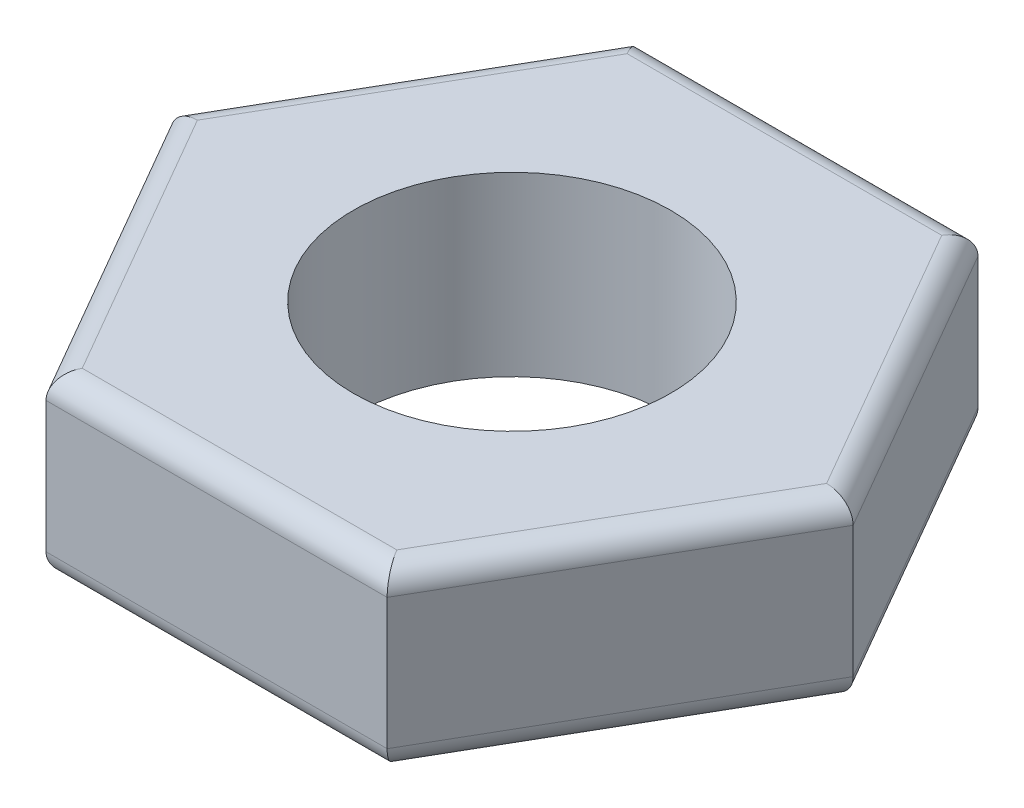
ISO-10303-21;
HEADER;
FILE_DESCRIPTION(('STEP AP214'),'2;1');
FILE_NAME('part.step','',(''),(''),'','','');
FILE_SCHEMA(('AUTOMOTIVE_DESIGN { 1 0 10303 214 1 1 1 1 }'));
ENDSEC;
DATA;
#1=APPLICATION_CONTEXT('core data for automotive mechanical design processes');
#2=APPLICATION_PROTOCOL_DEFINITION('international standard','automotive_design',2000,#1);
#3=PRODUCT_CONTEXT('',#1,'mechanical');
#4=PRODUCT('Part','Part','',(#3));
#5=PRODUCT_RELATED_PRODUCT_CATEGORY('part','',(#4));
#6=PRODUCT_DEFINITION_FORMATION('','',#4);
#7=PRODUCT_DEFINITION_CONTEXT('part definition',#1,'design');
#8=PRODUCT_DEFINITION('design','',#6,#7);
#9=PRODUCT_DEFINITION_SHAPE('','',#8);
#10=(LENGTH_UNIT() NAMED_UNIT(*) SI_UNIT(.MILLI.,.METRE.));
#11=(NAMED_UNIT(*) PLANE_ANGLE_UNIT() SI_UNIT($,.RADIAN.));
#12=(NAMED_UNIT(*) SI_UNIT($,.STERADIAN.) SOLID_ANGLE_UNIT());
#13=UNCERTAINTY_MEASURE_WITH_UNIT(LENGTH_MEASURE(1.E-05),#10,'distance_accuracy_value','');
#14=(GEOMETRIC_REPRESENTATION_CONTEXT(3) GLOBAL_UNCERTAINTY_ASSIGNED_CONTEXT((#13)) GLOBAL_UNIT_ASSIGNED_CONTEXT((#10,
#11,#12)) REPRESENTATION_CONTEXT('',''));
#15=CARTESIAN_POINT('',(0.,0.,0.));
#16=DIRECTION('',(0.,0.,1.));
#17=DIRECTION('',(1.,0.,0.));
#18=AXIS2_PLACEMENT_3D('',#15,#16,#17);
#19=CARTESIAN_POINT('',(0.,3.85,0.));
#20=DIRECTION('',(0.,1.,0.));
#21=DIRECTION('',(0.,0.,1.));
#22=AXIS2_PLACEMENT_3D('',#19,#20,#21);
#23=PLANE('',#22);
#24=DIRECTION('',(-0.500000000000001,0.,-0.866025403784438));
#25=VECTOR('',#24,1.);
#26=CARTESIAN_POINT('',(3.27646277765111,3.85,-6.17500000000001));
#27=LINE('',#26,#25);
#28=CARTESIAN_POINT('',(6.84160068989707,3.85,0.));
#29=VERTEX_POINT('',#28);
#30=CARTESIAN_POINT('',(3.42080034494852,3.85,-5.92500000000001));
#31=VERTEX_POINT('',#30);
#32=EDGE_CURVE('E64',#29,#31,#27,.T.);
#33=ORIENTED_EDGE('',*,*,#32,.T.);
#34=DIRECTION('',(-1.,0.,0.));
#35=VECTOR('',#34,1.);
#36=CARTESIAN_POINT('',(-3.70947547954338,3.85,-5.92499999999999));
#37=LINE('',#36,#35);
#38=CARTESIAN_POINT('',(-3.42080034494856,3.85,-5.92499999999999));
#39=VERTEX_POINT('',#38);
#40=EDGE_CURVE('E11',#31,#39,#37,.T.);
#41=ORIENTED_EDGE('',*,*,#40,.T.);
#42=DIRECTION('',(-0.499999999999995,0.,0.866025403784442));
#43=VECTOR('',#42,1.);
#44=CARTESIAN_POINT('',(-6.98593825719447,3.85,0.25000000000005));
#45=LINE('',#44,#43);
#46=CARTESIAN_POINT('',(-6.84160068989707,3.85,0.));
#47=VERTEX_POINT('',#46);
#48=EDGE_CURVE('E49',#39,#47,#45,.T.);
#49=ORIENTED_EDGE('',*,*,#48,.T.);
#50=DIRECTION('',(0.500000000000007,0.,0.866025403784435));
#51=VECTOR('',#50,1.);
#52=CARTESIAN_POINT('',(-3.27646277765107,3.85,6.17500000000004));
#53=LINE('',#52,#51);
#54=CARTESIAN_POINT('',(-3.42080034494848,3.85,5.92500000000004));
#55=VERTEX_POINT('',#54);
#56=EDGE_CURVE('E231',#47,#55,#53,.T.);
#57=ORIENTED_EDGE('',*,*,#56,.T.);
#58=DIRECTION('',(1.,0.,0.));
#59=VECTOR('',#58,1.);
#60=CARTESIAN_POINT('',(3.70947547954342,3.85,5.92499999999996));
#61=LINE('',#60,#59);
#62=CARTESIAN_POINT('',(3.42080034494861,3.85,5.92499999999997));
#63=VERTEX_POINT('',#62);
#64=EDGE_CURVE('E163',#55,#63,#61,.T.);
#65=ORIENTED_EDGE('',*,*,#64,.T.);
#66=DIRECTION('',(0.499999999999995,0.,-0.866025403784442));
#67=VECTOR('',#66,1.);
#68=CARTESIAN_POINT('',(6.98593825719448,3.85,-0.249999999999998));
#69=LINE('',#68,#67);
#70=EDGE_CURVE('E234',#63,#29,#69,.T.);
#71=ORIENTED_EDGE('',*,*,#70,.T.);
#72=EDGE_LOOP('',(#33,#41,#49,#57,#65,#71));
#73=FACE_BOUND('',#72,.T.);
#74=CARTESIAN_POINT('',(0.,3.85,0.));
#75=DIRECTION('',(0.,1.,0.));
#76=DIRECTION('',(0.,0.,1.));
#77=AXIS2_PLACEMENT_3D('',#74,#75,#76);
#78=CIRCLE('',#77,3.45);
#79=CARTESIAN_POINT('',(0.,3.85,-3.45));
#80=VERTEX_POINT('',#79);
#81=EDGE_CURVE('E325',#80,#80,#78,.T.);
#82=ORIENTED_EDGE('',*,*,#81,.F.);
#83=EDGE_LOOP('',(#82));
#84=FACE_BOUND('',#83,.T.);
#85=ADVANCED_FACE('F39',(#73,#84),#23,.T.);
#86=CARTESIAN_POINT('',(0.,0.,0.));
#87=DIRECTION('',(0.,1.,0.));
#88=DIRECTION('',(0.,0.,1.));
#89=AXIS2_PLACEMENT_3D('',#86,#87,#88);
#90=PLANE('',#89);
#91=DIRECTION('',(1.,0.,0.));
#92=VECTOR('',#91,1.);
#93=CARTESIAN_POINT('',(0.,0.,5.925));
#94=LINE('',#93,#92);
#95=CARTESIAN_POINT('',(3.42080034494861,0.,5.92499999999997));
#96=VERTEX_POINT('',#95);
#97=CARTESIAN_POINT('',(-3.42080034494848,0.,5.92500000000004));
#98=VERTEX_POINT('',#97);
#99=EDGE_CURVE('E196',#96,#98,#94,.F.);
#100=ORIENTED_EDGE('',*,*,#99,.T.);
#101=DIRECTION('',(0.500000000000007,0.,0.866025403784435));
#102=VECTOR('',#101,1.);
#103=CARTESIAN_POINT('',(-5.13120051742278,0.,2.96250000000004));
#104=LINE('',#103,#102);
#105=CARTESIAN_POINT('',(-6.84160068989707,0.,0.));
#106=VERTEX_POINT('',#105);
#107=EDGE_CURVE('E146',#98,#106,#104,.F.);
#108=ORIENTED_EDGE('',*,*,#107,.T.);
#109=DIRECTION('',(-0.499999999999995,0.,0.866025403784442));
#110=VECTOR('',#109,1.);
#111=CARTESIAN_POINT('',(-5.13120051742282,0.,-2.96249999999997));
#112=LINE('',#111,#110);
#113=CARTESIAN_POINT('',(-3.42080034494856,0.,-5.92499999999999));
#114=VERTEX_POINT('',#113);
#115=EDGE_CURVE('E178',#106,#114,#112,.F.);
#116=ORIENTED_EDGE('',*,*,#115,.T.);
#117=DIRECTION('',(-1.,0.,0.));
#118=VECTOR('',#117,1.);
#119=CARTESIAN_POINT('',(0.,0.,-5.925));
#120=LINE('',#119,#118);
#121=CARTESIAN_POINT('',(3.42080034494852,0.,-5.92500000000001));
#122=VERTEX_POINT('',#121);
#123=EDGE_CURVE('E187',#114,#122,#120,.F.);
#124=ORIENTED_EDGE('',*,*,#123,.T.);
#125=DIRECTION('',(-0.500000000000001,0.,-0.866025403784438));
#126=VECTOR('',#125,1.);
#127=CARTESIAN_POINT('',(5.1312005174228,0.,-2.96250000000001));
#128=LINE('',#127,#126);
#129=CARTESIAN_POINT('',(6.84160068989707,0.,0.));
#130=VERTEX_POINT('',#129);
#131=EDGE_CURVE('E190',#122,#130,#128,.F.);
#132=ORIENTED_EDGE('',*,*,#131,.T.);
#133=DIRECTION('',(0.499999999999995,0.,-0.866025403784442));
#134=VECTOR('',#133,1.);
#135=CARTESIAN_POINT('',(5.13120051742284,0.,2.96249999999998));
#136=LINE('',#135,#134);
#137=EDGE_CURVE('E193',#130,#96,#136,.F.);
#138=ORIENTED_EDGE('',*,*,#137,.T.);
#139=EDGE_LOOP('',(#100,#108,#116,#124,#132,#138));
#140=FACE_BOUND('',#139,.T.);
#141=CARTESIAN_POINT('',(0.,0.,0.));
#142=DIRECTION('',(0.,1.,0.));
#143=DIRECTION('',(0.,0.,1.));
#144=AXIS2_PLACEMENT_3D('',#141,#142,#143);
#145=CIRCLE('',#144,3.45);
#146=CARTESIAN_POINT('',(0.,0.,-3.45));
#147=VERTEX_POINT('',#146);
#148=EDGE_CURVE('E263',#147,#147,#145,.T.);
#149=ORIENTED_EDGE('',*,*,#148,.T.);
#150=EDGE_LOOP('',(#149));
#151=FACE_BOUND('',#150,.T.);
#152=ADVANCED_FACE('F302',(#140,#151),#90,.F.);
#153=CARTESIAN_POINT('',(3.70947547954342,3.85,6.42499999999996));
#154=DIRECTION('',(-0.866025403784442,0.,-0.499999999999995));
#155=DIRECTION('',(-0.499999999999995,0.,0.866025403784442));
#156=AXIS2_PLACEMENT_3D('',#153,#154,#155);
#157=PLANE('',#156);
#158=DIRECTION('',(0.,-1.,0.));
#159=VECTOR('',#158,1.);
#160=CARTESIAN_POINT('',(3.70947547954342,3.85,6.42499999999996));
#161=LINE('',#160,#159);
#162=CARTESIAN_POINT('',(3.70947547954342,3.35,6.42499999999996));
#163=VERTEX_POINT('',#162);
#164=CARTESIAN_POINT('',(3.70947547954342,0.500000000000001,6.42499999999996));
#165=VERTEX_POINT('',#164);
#166=EDGE_CURVE('E139',#163,#165,#161,.T.);
#167=ORIENTED_EDGE('',*,*,#166,.T.);
#168=DIRECTION('',(0.499999999999995,0.,-0.866025403784442));
#169=VECTOR('',#168,1.);
#170=CARTESIAN_POINT('',(3.70947547954342,0.5,6.42499999999996));
#171=LINE('',#170,#169);
#172=CARTESIAN_POINT('',(7.4189509590867,0.500000000000001,0.));
#173=VERTEX_POINT('',#172);
#174=EDGE_CURVE('E207',#165,#173,#171,.T.);
#175=ORIENTED_EDGE('',*,*,#174,.T.);
#176=DIRECTION('',(0.,-1.,0.));
#177=VECTOR('',#176,1.);
#178=CARTESIAN_POINT('',(7.4189509590867,3.85,0.));
#179=LINE('',#178,#177);
#180=CARTESIAN_POINT('',(7.4189509590867,3.35,0.));
#181=VERTEX_POINT('',#180);
#182=EDGE_CURVE('E174',#181,#173,#179,.T.);
#183=ORIENTED_EDGE('',*,*,#182,.F.);
#184=DIRECTION('',(0.499999999999995,0.,-0.866025403784442));
#185=VECTOR('',#184,1.);
#186=CARTESIAN_POINT('',(3.70947547954342,3.35,6.42499999999996));
#187=LINE('',#186,#185);
#188=EDGE_CURVE('E204',#181,#163,#187,.F.);
#189=ORIENTED_EDGE('',*,*,#188,.T.);
#190=EDGE_LOOP('',(#167,#175,#183,#189));
#191=FACE_BOUND('',#190,.T.);
#192=ADVANCED_FACE('F283',(#191),#157,.F.);
#193=CARTESIAN_POINT('',(7.4189509590867,3.85,0.));
#194=DIRECTION('',(-0.866025403784438,0.,0.500000000000001));
#195=DIRECTION('',(0.500000000000001,0.,0.866025403784438));
#196=AXIS2_PLACEMENT_3D('',#193,#194,#195);
#197=PLANE('',#196);
#198=ORIENTED_EDGE('',*,*,#182,.T.);
#199=DIRECTION('',(-0.500000000000001,0.,-0.866025403784438));
#200=VECTOR('',#199,1.);
#201=CARTESIAN_POINT('',(7.4189509590867,0.5,0.));
#202=LINE('',#201,#200);
#203=CARTESIAN_POINT('',(3.70947547954333,0.500000000000001,-6.42500000000001));
#204=VERTEX_POINT('',#203);
#205=EDGE_CURVE('E213',#173,#204,#202,.T.);
#206=ORIENTED_EDGE('',*,*,#205,.T.);
#207=DIRECTION('',(0.,-1.,0.));
#208=VECTOR('',#207,1.);
#209=CARTESIAN_POINT('',(3.70947547954333,3.85,-6.42500000000001));
#210=LINE('',#209,#208);
#211=CARTESIAN_POINT('',(3.70947547954333,3.35,-6.42500000000001));
#212=VERTEX_POINT('',#211);
#213=EDGE_CURVE('E181',#212,#204,#210,.T.);
#214=ORIENTED_EDGE('',*,*,#213,.F.);
#215=DIRECTION('',(-0.500000000000001,0.,-0.866025403784438));
#216=VECTOR('',#215,1.);
#217=CARTESIAN_POINT('',(7.4189509590867,3.35,0.));
#218=LINE('',#217,#216);
#219=EDGE_CURVE('E210',#212,#181,#218,.F.);
#220=ORIENTED_EDGE('',*,*,#219,.T.);
#221=EDGE_LOOP('',(#198,#206,#214,#220));
#222=FACE_BOUND('',#221,.T.);
#223=ADVANCED_FACE('F287',(#222),#197,.F.);
#224=CARTESIAN_POINT('',(3.70947547954333,3.85,-6.42500000000001));
#225=DIRECTION('',(0.,0.,1.));
#226=DIRECTION('',(1.,0.,0.));
#227=AXIS2_PLACEMENT_3D('',#224,#225,#226);
#228=PLANE('',#227);
#229=ORIENTED_EDGE('',*,*,#213,.T.);
#230=DIRECTION('',(-1.,0.,0.));
#231=VECTOR('',#230,1.);
#232=CARTESIAN_POINT('',(3.70947547954333,0.5,-6.42500000000001));
#233=LINE('',#232,#231);
#234=CARTESIAN_POINT('',(-3.70947547954338,0.500000000000001,-6.42499999999999));
#235=VERTEX_POINT('',#234);
#236=EDGE_CURVE('E220',#204,#235,#233,.T.);
#237=ORIENTED_EDGE('',*,*,#236,.T.);
#238=DIRECTION('',(0.,-1.,0.));
#239=VECTOR('',#238,1.);
#240=CARTESIAN_POINT('',(-3.70947547954338,3.85,-6.42499999999999));
#241=LINE('',#240,#239);
#242=CARTESIAN_POINT('',(-3.70947547954338,3.35,-6.42499999999999));
#243=VERTEX_POINT('',#242);
#244=EDGE_CURVE('E314',#243,#235,#241,.T.);
#245=ORIENTED_EDGE('',*,*,#244,.F.);
#246=DIRECTION('',(-1.,0.,0.));
#247=VECTOR('',#246,1.);
#248=CARTESIAN_POINT('',(3.70947547954333,3.35,-6.42500000000001));
#249=LINE('',#248,#247);
#250=EDGE_CURVE('E216',#243,#212,#249,.F.);
#251=ORIENTED_EDGE('',*,*,#250,.T.);
#252=EDGE_LOOP('',(#229,#237,#245,#251));
#253=FACE_BOUND('',#252,.T.);
#254=ADVANCED_FACE('F313',(#253),#228,.F.);
#255=CARTESIAN_POINT('',(-3.70947547954338,3.85,-6.42499999999999));
#256=DIRECTION('',(0.866025403784442,0.,0.499999999999995));
#257=DIRECTION('',(0.499999999999995,0.,-0.866025403784442));
#258=AXIS2_PLACEMENT_3D('',#255,#256,#257);
#259=PLANE('',#258);
#260=ORIENTED_EDGE('',*,*,#244,.T.);
#261=DIRECTION('',(-0.499999999999995,0.,0.866025403784442));
#262=VECTOR('',#261,1.);
#263=CARTESIAN_POINT('',(-3.70947547954338,0.5,-6.42499999999999));
#264=LINE('',#263,#262);
#265=CARTESIAN_POINT('',(-7.4189509590867,0.500000000000001,0.));
#266=VERTEX_POINT('',#265);
#267=EDGE_CURVE('E226',#235,#266,#264,.T.);
#268=ORIENTED_EDGE('',*,*,#267,.T.);
#269=DIRECTION('',(0.,-1.,0.));
#270=VECTOR('',#269,1.);
#271=CARTESIAN_POINT('',(-7.4189509590867,3.85,0.));
#272=LINE('',#271,#270);
#273=CARTESIAN_POINT('',(-7.4189509590867,3.35,0.));
#274=VERTEX_POINT('',#273);
#275=EDGE_CURVE('E158',#274,#266,#272,.T.);
#276=ORIENTED_EDGE('',*,*,#275,.F.);
#277=DIRECTION('',(-0.499999999999995,0.,0.866025403784442));
#278=VECTOR('',#277,1.);
#279=CARTESIAN_POINT('',(-3.70947547954338,3.35,-6.42499999999999));
#280=LINE('',#279,#278);
#281=EDGE_CURVE('E223',#274,#243,#280,.F.);
#282=ORIENTED_EDGE('',*,*,#281,.T.);
#283=EDGE_LOOP('',(#260,#268,#276,#282));
#284=FACE_BOUND('',#283,.T.);
#285=ADVANCED_FACE('F316',(#284),#259,.F.);
#286=CARTESIAN_POINT('',(-7.4189509590867,3.85,0.));
#287=DIRECTION('',(0.866025403784435,0.,-0.500000000000007));
#288=DIRECTION('',(-0.500000000000007,0.,-0.866025403784435));
#289=AXIS2_PLACEMENT_3D('',#286,#287,#288);
#290=PLANE('',#289);
#291=ORIENTED_EDGE('',*,*,#275,.T.);
#292=DIRECTION('',(0.500000000000007,0.,0.866025403784435));
#293=VECTOR('',#292,1.);
#294=CARTESIAN_POINT('',(-7.4189509590867,0.5,0.));
#295=LINE('',#294,#293);
#296=CARTESIAN_POINT('',(-3.70947547954329,0.500000000000001,6.42500000000004));
#297=VERTEX_POINT('',#296);
#298=EDGE_CURVE('E156',#266,#297,#295,.T.);
#299=ORIENTED_EDGE('',*,*,#298,.T.);
#300=DIRECTION('',(0.,-1.,0.));
#301=VECTOR('',#300,1.);
#302=CARTESIAN_POINT('',(-3.70947547954329,3.85,6.42500000000004));
#303=LINE('',#302,#301);
#304=CARTESIAN_POINT('',(-3.70947547954329,3.35,6.42500000000004));
#305=VERTEX_POINT('',#304);
#306=EDGE_CURVE('E137',#305,#297,#303,.T.);
#307=ORIENTED_EDGE('',*,*,#306,.F.);
#308=DIRECTION('',(0.500000000000007,0.,0.866025403784435));
#309=VECTOR('',#308,1.);
#310=CARTESIAN_POINT('',(-7.4189509590867,3.35,0.));
#311=LINE('',#310,#309);
#312=EDGE_CURVE('E153',#305,#274,#311,.F.);
#313=ORIENTED_EDGE('',*,*,#312,.T.);
#314=EDGE_LOOP('',(#291,#299,#307,#313));
#315=FACE_BOUND('',#314,.T.);
#316=ADVANCED_FACE('F151',(#315),#290,.F.);
#317=CARTESIAN_POINT('',(-3.70947547954329,3.85,6.42500000000004));
#318=DIRECTION('',(0.,0.,-1.));
#319=DIRECTION('',(-1.,0.,0.));
#320=AXIS2_PLACEMENT_3D('',#317,#318,#319);
#321=PLANE('',#320);
#322=ORIENTED_EDGE('',*,*,#306,.T.);
#323=DIRECTION('',(1.,0.,0.));
#324=VECTOR('',#323,1.);
#325=CARTESIAN_POINT('',(-3.70947547954329,0.5,6.42500000000004));
#326=LINE('',#325,#324);
#327=EDGE_CURVE('E145',#297,#165,#326,.T.);
#328=ORIENTED_EDGE('',*,*,#327,.T.);
#329=ORIENTED_EDGE('',*,*,#166,.F.);
#330=DIRECTION('',(1.,0.,0.));
#331=VECTOR('',#330,1.);
#332=CARTESIAN_POINT('',(-3.70947547954329,3.35,6.42500000000004));
#333=LINE('',#332,#331);
#334=EDGE_CURVE('E134',#163,#305,#333,.F.);
#335=ORIENTED_EDGE('',*,*,#334,.T.);
#336=EDGE_LOOP('',(#322,#328,#329,#335));
#337=FACE_BOUND('',#336,.T.);
#338=ADVANCED_FACE('F136',(#337),#321,.F.);
#339=CARTESIAN_POINT('',(0.,3.85,0.));
#340=DIRECTION('',(0.,-1.,0.));
#341=DIRECTION('',(0.,0.,-1.));
#342=AXIS2_PLACEMENT_3D('',#339,#340,#341);
#343=CYLINDRICAL_SURFACE('',#342,3.45);
#344=CARTESIAN_POINT('',(0.,3.85,-3.45));
#345=CARTESIAN_POINT('',(0.,3.80989583333333,-3.45));
#346=CARTESIAN_POINT('',(0.,3.76979166666667,-3.45));
#347=CARTESIAN_POINT('',(0.,3.68958333333333,-3.45));
#348=CARTESIAN_POINT('',(0.,3.64947916666667,-3.45));
#349=CARTESIAN_POINT('',(0.,3.56927083333333,-3.45));
#350=CARTESIAN_POINT('',(0.,3.52916666666667,-3.45));
#351=CARTESIAN_POINT('',(0.,3.44895833333333,-3.45));
#352=CARTESIAN_POINT('',(0.,3.40885416666667,-3.45));
#353=CARTESIAN_POINT('',(0.,3.32864583333333,-3.45));
#354=CARTESIAN_POINT('',(0.,3.28854166666667,-3.45));
#355=CARTESIAN_POINT('',(0.,3.20833333333333,-3.45));
#356=CARTESIAN_POINT('',(0.,3.16822916666667,-3.45));
#357=CARTESIAN_POINT('',(0.,3.08802083333333,-3.45));
#358=CARTESIAN_POINT('',(0.,3.04791666666667,-3.45));
#359=CARTESIAN_POINT('',(0.,2.96770833333333,-3.45));
#360=CARTESIAN_POINT('',(0.,2.92760416666667,-3.45));
#361=CARTESIAN_POINT('',(0.,2.84739583333333,-3.45));
#362=CARTESIAN_POINT('',(0.,2.80729166666667,-3.45));
#363=CARTESIAN_POINT('',(0.,2.72708333333333,-3.45));
#364=CARTESIAN_POINT('',(0.,2.68697916666667,-3.45));
#365=CARTESIAN_POINT('',(0.,2.60677083333333,-3.45));
#366=CARTESIAN_POINT('',(0.,2.56666666666667,-3.45));
#367=CARTESIAN_POINT('',(0.,2.48645833333333,-3.45));
#368=CARTESIAN_POINT('',(0.,2.44635416666667,-3.45));
#369=CARTESIAN_POINT('',(0.,2.36614583333333,-3.45));
#370=CARTESIAN_POINT('',(0.,2.32604166666667,-3.45));
#371=CARTESIAN_POINT('',(0.,2.24583333333333,-3.45));
#372=CARTESIAN_POINT('',(0.,2.20572916666667,-3.45));
#373=CARTESIAN_POINT('',(0.,2.12552083333333,-3.45));
#374=CARTESIAN_POINT('',(0.,2.08541666666667,-3.45));
#375=CARTESIAN_POINT('',(0.,2.00520833333333,-3.45));
#376=CARTESIAN_POINT('',(0.,1.96510416666667,-3.45));
#377=CARTESIAN_POINT('',(0.,1.88489583333333,-3.45));
#378=CARTESIAN_POINT('',(0.,1.84479166666667,-3.45));
#379=CARTESIAN_POINT('',(0.,1.76458333333333,-3.45));
#380=CARTESIAN_POINT('',(0.,1.72447916666667,-3.45));
#381=CARTESIAN_POINT('',(0.,1.64427083333333,-3.45));
#382=CARTESIAN_POINT('',(0.,1.60416666666667,-3.45));
#383=CARTESIAN_POINT('',(0.,1.52395833333333,-3.45));
#384=CARTESIAN_POINT('',(0.,1.48385416666667,-3.45));
#385=CARTESIAN_POINT('',(0.,1.40364583333333,-3.45));
#386=CARTESIAN_POINT('',(0.,1.36354166666667,-3.45));
#387=CARTESIAN_POINT('',(0.,1.28333333333333,-3.45));
#388=CARTESIAN_POINT('',(0.,1.24322916666667,-3.45));
#389=CARTESIAN_POINT('',(0.,1.16302083333333,-3.45));
#390=CARTESIAN_POINT('',(0.,1.12291666666667,-3.45));
#391=CARTESIAN_POINT('',(0.,1.04270833333333,-3.45));
#392=CARTESIAN_POINT('',(0.,1.00260416666667,-3.45));
#393=CARTESIAN_POINT('',(0.,0.922395833333333,-3.45));
#394=CARTESIAN_POINT('',(0.,0.882291666666666,-3.45));
#395=CARTESIAN_POINT('',(0.,0.802083333333333,-3.45));
#396=CARTESIAN_POINT('',(0.,0.761979166666666,-3.45));
#397=CARTESIAN_POINT('',(0.,0.681770833333333,-3.45));
#398=CARTESIAN_POINT('',(0.,0.641666666666666,-3.45));
#399=CARTESIAN_POINT('',(0.,0.561458333333333,-3.45));
#400=CARTESIAN_POINT('',(0.,0.521354166666666,-3.45));
#401=CARTESIAN_POINT('',(0.,0.441145833333333,-3.45));
#402=CARTESIAN_POINT('',(0.,0.401041666666666,-3.45));
#403=CARTESIAN_POINT('',(0.,0.320833333333333,-3.45));
#404=CARTESIAN_POINT('',(0.,0.280729166666666,-3.45));
#405=CARTESIAN_POINT('',(0.,0.200520833333333,-3.45));
#406=CARTESIAN_POINT('',(0.,0.160416666666666,-3.45));
#407=CARTESIAN_POINT('',(0.,0.080208333333333,-3.45));
#408=CARTESIAN_POINT('',(0.,0.0401041666666663,-3.45));
#409=CARTESIAN_POINT('',(0.,0.,-3.45));
#410=B_SPLINE_CURVE_WITH_KNOTS('',3,(#344,#345,#346,#347,#348,#349,#350,#351,#352,#353,#354,
#355,#356,#357,#358,#359,#360,#361,#362,#363,#364,#365,#366,#367,#368,#369,#370,#371,#372,#373,
#374,#375,#376,#377,#378,#379,#380,#381,#382,#383,#384,#385,#386,#387,#388,#389,#390,#391,#392,
#393,#394,#395,#396,#397,#398,#399,#400,#401,#402,#403,#404,#405,#406,#407,#408,#409),
.UNSPECIFIED.,.F.,.F.,(4,2,2,2,2,2,2,2,2,2,2,2,2,2,2,2,2,2,2,2,2,2,2,2,2,2,2,2,2,2,2,2,4),(0.,
0.1203125,0.240625,0.3609375,0.48125,0.6015625,0.721875,0.842187500000001,0.9625,1.0828125,
1.203125,1.3234375,1.44375,1.5640625,1.684375,1.8046875,1.925,2.0453125,2.165625,2.2859375,
2.40625,2.5265625,2.646875,2.7671875,2.8875,3.0078125,3.128125,3.2484375,3.36875,3.4890625,
3.609375,3.7296875,3.85),.UNSPECIFIED.);
#411=EDGE_CURVE('BSEAM333',#80,#147,#410,.T.);
#412=ORIENTED_EDGE('',*,*,#81,.T.);
#413=ORIENTED_EDGE('',*,*,#148,.F.);
#414=ORIENTED_EDGE('',*,*,#411,.T.);
#415=ORIENTED_EDGE('',*,*,#411,.F.);
#416=EDGE_LOOP('',(#412,#414,#413,#415));
#417=FACE_BOUND('',#416,.T.);
#418=ADVANCED_FACE('F333',(#417),#343,.F.);
#419=CARTESIAN_POINT('',(6.98593825719448,0.5,0.250000000000001));
#420=DIRECTION('',(-0.500000000000001,0.,-0.866025403784438));
#421=DIRECTION('',(-0.866025403784438,0.,0.500000000000001));
#422=AXIS2_PLACEMENT_3D('',#419,#420,#421);
#423=CYLINDRICAL_SURFACE('',#422,0.5);
#424=CARTESIAN_POINT('',(6.84160068989707,0.5,0.));
#425=DIRECTION('',(0.,0.,-1.));
#426=DIRECTION('',(-1.,0.,0.));
#427=AXIS2_PLACEMENT_3D('',#424,#425,#426);
#428=ELLIPSE('',#427,0.577350269189625,0.5);
#429=EDGE_CURVE('E255',#130,#173,#428,.F.);
#430=ORIENTED_EDGE('',*,*,#429,.F.);
#431=ORIENTED_EDGE('',*,*,#131,.F.);
#432=CARTESIAN_POINT('',(3.42080034494852,0.5,-5.92500000000001));
#433=DIRECTION('',(-0.86602540378444,0.,-0.499999999999998));
#434=DIRECTION('',(-0.499999999999998,0.,0.86602540378444));
#435=AXIS2_PLACEMENT_3D('',#432,#433,#434);
#436=ELLIPSE('',#435,0.577350269189626,0.5);
#437=EDGE_CURVE('E259',#204,#122,#436,.T.);
#438=ORIENTED_EDGE('',*,*,#437,.F.);
#439=ORIENTED_EDGE('',*,*,#205,.F.);
#440=EDGE_LOOP('',(#430,#431,#438,#439));
#441=FACE_BOUND('',#440,.T.);
#442=ADVANCED_FACE('F293',(#441),#423,.T.);
#443=CARTESIAN_POINT('',(3.70947547954334,0.5,-5.92500000000001));
#444=DIRECTION('',(-1.,0.,0.));
#445=DIRECTION('',(0.,0.,1.));
#446=AXIS2_PLACEMENT_3D('',#443,#444,#445);
#447=CYLINDRICAL_SURFACE('',#446,0.5);
#448=ORIENTED_EDGE('',*,*,#437,.T.);
#449=ORIENTED_EDGE('',*,*,#123,.F.);
#450=CARTESIAN_POINT('',(-3.42080034494856,0.5,-5.92499999999999));
#451=DIRECTION('',(-0.866025403784436,0.,0.500000000000004));
#452=DIRECTION('',(0.500000000000004,0.,0.866025403784436));
#453=AXIS2_PLACEMENT_3D('',#450,#451,#452);
#454=ELLIPSE('',#453,0.577350269189626,0.5);
#455=EDGE_CURVE('E251',#235,#114,#454,.T.);
#456=ORIENTED_EDGE('',*,*,#455,.F.);
#457=ORIENTED_EDGE('',*,*,#236,.F.);
#458=EDGE_LOOP('',(#448,#449,#456,#457));
#459=FACE_BOUND('',#458,.T.);
#460=ADVANCED_FACE('F307',(#459),#447,.T.);
#461=CARTESIAN_POINT('',(3.2764627776512,0.5,6.17499999999996));
#462=DIRECTION('',(0.499999999999995,0.,-0.866025403784442));
#463=DIRECTION('',(-0.866025403784442,0.,-0.499999999999995));
#464=AXIS2_PLACEMENT_3D('',#461,#462,#463);
#465=CYLINDRICAL_SURFACE('',#464,0.5);
#466=ORIENTED_EDGE('',*,*,#429,.T.);
#467=ORIENTED_EDGE('',*,*,#174,.F.);
#468=CARTESIAN_POINT('',(3.42080034494861,0.5,5.92499999999997));
#469=DIRECTION('',(0.866025403784434,0.,-0.500000000000007));
#470=DIRECTION('',(-0.500000000000007,0.,-0.866025403784435));
#471=AXIS2_PLACEMENT_3D('',#468,#469,#470);
#472=ELLIPSE('',#471,0.577350269189625,0.5);
#473=EDGE_CURVE('E247',#96,#165,#472,.F.);
#474=ORIENTED_EDGE('',*,*,#473,.F.);
#475=ORIENTED_EDGE('',*,*,#137,.F.);
#476=EDGE_LOOP('',(#466,#467,#474,#475));
#477=FACE_BOUND('',#476,.T.);
#478=ADVANCED_FACE('F298',(#477),#465,.T.);
#479=CARTESIAN_POINT('',(-3.27646277765116,0.5,-6.17499999999999));
#480=DIRECTION('',(-0.499999999999995,0.,0.866025403784442));
#481=DIRECTION('',(0.866025403784442,0.,0.499999999999995));
#482=AXIS2_PLACEMENT_3D('',#479,#480,#481);
#483=CYLINDRICAL_SURFACE('',#482,0.5);
#484=ORIENTED_EDGE('',*,*,#455,.T.);
#485=ORIENTED_EDGE('',*,*,#115,.F.);
#486=CARTESIAN_POINT('',(-6.84160068989707,0.5,0.));
#487=DIRECTION('',(0.,0.,1.));
#488=DIRECTION('',(-1.,0.,0.));
#489=AXIS2_PLACEMENT_3D('',#486,#487,#488);
#490=ELLIPSE('',#489,0.577350269189626,0.5);
#491=EDGE_CURVE('E244',#266,#106,#490,.T.);
#492=ORIENTED_EDGE('',*,*,#491,.F.);
#493=ORIENTED_EDGE('',*,*,#267,.F.);
#494=EDGE_LOOP('',(#484,#485,#492,#493));
#495=FACE_BOUND('',#494,.T.);
#496=ADVANCED_FACE('F363',(#495),#483,.T.);
#497=CARTESIAN_POINT('',(-3.70947547954329,0.5,5.92500000000004));
#498=DIRECTION('',(1.,0.,0.));
#499=DIRECTION('',(0.,0.,-1.));
#500=AXIS2_PLACEMENT_3D('',#497,#498,#499);
#501=CYLINDRICAL_SURFACE('',#500,0.5);
#502=ORIENTED_EDGE('',*,*,#473,.T.);
#503=ORIENTED_EDGE('',*,*,#327,.F.);
#504=CARTESIAN_POINT('',(-3.42080034494848,0.5,5.92500000000004));
#505=DIRECTION('',(0.866025403784443,0.,0.499999999999992));
#506=DIRECTION('',(0.499999999999992,0.,-0.866025403784443));
#507=AXIS2_PLACEMENT_3D('',#504,#505,#506);
#508=ELLIPSE('',#507,0.577350269189626,0.5);
#509=EDGE_CURVE('E241',#98,#297,#508,.F.);
#510=ORIENTED_EDGE('',*,*,#509,.F.);
#511=ORIENTED_EDGE('',*,*,#99,.F.);
#512=EDGE_LOOP('',(#502,#503,#510,#511));
#513=FACE_BOUND('',#512,.T.);
#514=ADVANCED_FACE('F359',(#513),#501,.T.);
#515=CARTESIAN_POINT('',(-6.98593825719448,0.5,-0.249999999999952));
#516=DIRECTION('',(0.500000000000007,0.,0.866025403784435));
#517=DIRECTION('',(0.866025403784435,0.,-0.500000000000007));
#518=AXIS2_PLACEMENT_3D('',#515,#516,#517);
#519=CYLINDRICAL_SURFACE('',#518,0.5);
#520=ORIENTED_EDGE('',*,*,#491,.T.);
#521=ORIENTED_EDGE('',*,*,#107,.F.);
#522=ORIENTED_EDGE('',*,*,#509,.T.);
#523=ORIENTED_EDGE('',*,*,#298,.F.);
#524=EDGE_LOOP('',(#520,#521,#522,#523));
#525=FACE_BOUND('',#524,.T.);
#526=ADVANCED_FACE('F356',(#525),#519,.T.);
#527=CARTESIAN_POINT('',(0.,3.35,5.925));
#528=DIRECTION('',(-1.,0.,0.));
#529=DIRECTION('',(0.,0.,1.));
#530=AXIS2_PLACEMENT_3D('',#527,#528,#529);
#531=CYLINDRICAL_SURFACE('',#530,0.5);
#532=CARTESIAN_POINT('',(-3.42080034494848,3.35,5.92500000000004));
#533=DIRECTION('',(-0.866025403784443,0.,-0.499999999999992));
#534=DIRECTION('',(-0.499999999999992,0.,0.866025403784443));
#535=AXIS2_PLACEMENT_3D('',#532,#533,#534);
#536=ELLIPSE('',#535,0.577350269189626,0.5);
#537=EDGE_CURVE('E162',#305,#55,#536,.T.);
#538=ORIENTED_EDGE('',*,*,#537,.F.);
#539=ORIENTED_EDGE('',*,*,#334,.F.);
#540=CARTESIAN_POINT('',(3.42080034494861,3.35,5.92499999999997));
#541=DIRECTION('',(-0.866025403784434,0.,0.500000000000007));
#542=DIRECTION('',(-0.500000000000007,0.,-0.866025403784435));
#543=AXIS2_PLACEMENT_3D('',#540,#541,#542);
#544=ELLIPSE('',#543,0.577350269189625,0.5);
#545=EDGE_CURVE('E43',#63,#163,#544,.F.);
#546=ORIENTED_EDGE('',*,*,#545,.F.);
#547=ORIENTED_EDGE('',*,*,#64,.F.);
#548=EDGE_LOOP('',(#538,#539,#546,#547));
#549=FACE_BOUND('',#548,.T.);
#550=ADVANCED_FACE('F41',(#549),#531,.T.);
#551=CARTESIAN_POINT('',(5.13120051742284,3.35,2.96249999999998));
#552=DIRECTION('',(-0.499999999999995,0.,0.866025403784442));
#553=DIRECTION('',(0.866025403784442,0.,0.499999999999995));
#554=AXIS2_PLACEMENT_3D('',#551,#552,#553);
#555=CYLINDRICAL_SURFACE('',#554,0.5);
#556=ORIENTED_EDGE('',*,*,#545,.T.);
#557=ORIENTED_EDGE('',*,*,#188,.F.);
#558=CARTESIAN_POINT('',(6.84160068989707,3.35,0.));
#559=DIRECTION('',(0.,0.,1.));
#560=DIRECTION('',(-1.,0.,0.));
#561=AXIS2_PLACEMENT_3D('',#558,#559,#560);
#562=ELLIPSE('',#561,0.577350269189625,0.5);
#563=EDGE_CURVE('E167',#29,#181,#562,.F.);
#564=ORIENTED_EDGE('',*,*,#563,.F.);
#565=ORIENTED_EDGE('',*,*,#70,.F.);
#566=EDGE_LOOP('',(#556,#557,#564,#565));
#567=FACE_BOUND('',#566,.T.);
#568=ADVANCED_FACE('F280',(#567),#555,.T.);
#569=CARTESIAN_POINT('',(-5.13120051742278,3.35,2.96250000000004));
#570=DIRECTION('',(-0.500000000000007,0.,-0.866025403784435));
#571=DIRECTION('',(-0.866025403784435,0.,0.500000000000007));
#572=AXIS2_PLACEMENT_3D('',#569,#570,#571);
#573=CYLINDRICAL_SURFACE('',#572,0.5);
#574=ORIENTED_EDGE('',*,*,#537,.T.);
#575=ORIENTED_EDGE('',*,*,#56,.F.);
#576=CARTESIAN_POINT('',(-6.84160068989707,3.35,0.));
#577=DIRECTION('',(0.,0.,-1.));
#578=DIRECTION('',(-1.,0.,0.));
#579=AXIS2_PLACEMENT_3D('',#576,#577,#578);
#580=ELLIPSE('',#579,0.577350269189626,0.5);
#581=EDGE_CURVE('E171',#274,#47,#580,.T.);
#582=ORIENTED_EDGE('',*,*,#581,.F.);
#583=ORIENTED_EDGE('',*,*,#312,.F.);
#584=EDGE_LOOP('',(#574,#575,#582,#583));
#585=FACE_BOUND('',#584,.T.);
#586=ADVANCED_FACE('F169',(#585),#573,.T.);
#587=CARTESIAN_POINT('',(5.1312005174228,3.35,-2.96250000000001));
#588=DIRECTION('',(0.500000000000001,0.,0.866025403784438));
#589=DIRECTION('',(0.866025403784438,0.,-0.500000000000001));
#590=AXIS2_PLACEMENT_3D('',#587,#588,#589);
#591=CYLINDRICAL_SURFACE('',#590,0.5);
#592=ORIENTED_EDGE('',*,*,#563,.T.);
#593=ORIENTED_EDGE('',*,*,#219,.F.);
#594=CARTESIAN_POINT('',(3.42080034494852,3.35,-5.92500000000001));
#595=DIRECTION('',(0.86602540378444,0.,0.499999999999998));
#596=DIRECTION('',(-0.499999999999998,0.,0.86602540378444));
#597=AXIS2_PLACEMENT_3D('',#594,#595,#596);
#598=ELLIPSE('',#597,0.577350269189626,0.5);
#599=EDGE_CURVE('E266',#31,#212,#598,.F.);
#600=ORIENTED_EDGE('',*,*,#599,.F.);
#601=ORIENTED_EDGE('',*,*,#32,.F.);
#602=EDGE_LOOP('',(#592,#593,#600,#601));
#603=FACE_BOUND('',#602,.T.);
#604=ADVANCED_FACE('F276',(#603),#591,.T.);
#605=CARTESIAN_POINT('',(-5.13120051742282,3.35,-2.96249999999997));
#606=DIRECTION('',(0.499999999999995,0.,-0.866025403784442));
#607=DIRECTION('',(-0.866025403784442,0.,-0.499999999999995));
#608=AXIS2_PLACEMENT_3D('',#605,#606,#607);
#609=CYLINDRICAL_SURFACE('',#608,0.5);
#610=ORIENTED_EDGE('',*,*,#581,.T.);
#611=ORIENTED_EDGE('',*,*,#48,.F.);
#612=CARTESIAN_POINT('',(-3.42080034494856,3.35,-5.92499999999999));
#613=DIRECTION('',(0.866025403784436,0.,-0.500000000000004));
#614=DIRECTION('',(-0.500000000000004,0.,-0.866025403784436));
#615=AXIS2_PLACEMENT_3D('',#612,#613,#614);
#616=ELLIPSE('',#615,0.577350269189626,0.5);
#617=EDGE_CURVE('E57',#243,#39,#616,.T.);
#618=ORIENTED_EDGE('',*,*,#617,.F.);
#619=ORIENTED_EDGE('',*,*,#281,.F.);
#620=EDGE_LOOP('',(#610,#611,#618,#619));
#621=FACE_BOUND('',#620,.T.);
#622=ADVANCED_FACE('F377',(#621),#609,.T.);
#623=CARTESIAN_POINT('',(0.,3.35,-5.925));
#624=DIRECTION('',(1.,0.,0.));
#625=DIRECTION('',(0.,0.,-1.));
#626=AXIS2_PLACEMENT_3D('',#623,#624,#625);
#627=CYLINDRICAL_SURFACE('',#626,0.5);
#628=ORIENTED_EDGE('',*,*,#599,.T.);
#629=ORIENTED_EDGE('',*,*,#250,.F.);
#630=ORIENTED_EDGE('',*,*,#617,.T.);
#631=ORIENTED_EDGE('',*,*,#40,.F.);
#632=EDGE_LOOP('',(#628,#629,#630,#631));
#633=FACE_BOUND('',#632,.T.);
#634=ADVANCED_FACE('F374',(#633),#627,.T.);
#635=CLOSED_SHELL('',(#85,#152,#192,#223,#254,#285,#316,#338,#418,#442,#460,#478,#496,#514,#526,
#550,#568,#586,#604,#622,#634));
#636=MANIFOLD_SOLID_BREP('B2',#635);
#637=ADVANCED_BREP_SHAPE_REPRESENTATION('',(#18,#636),#14);
#638=SHAPE_DEFINITION_REPRESENTATION(#9,#637);
ENDSEC;
END-ISO-10303-21;
